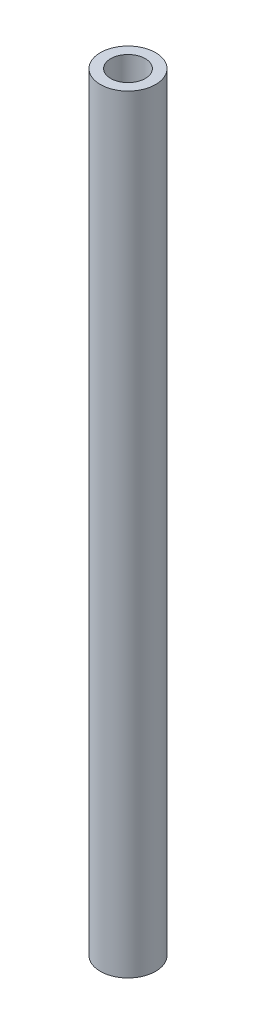
ISO-10303-21;
HEADER;
FILE_DESCRIPTION(('STEP AP214'),'2;1');
FILE_NAME('part.step','',(''),(''),'','','');
FILE_SCHEMA(('AUTOMOTIVE_DESIGN { 1 0 10303 214 1 1 1 1 }'));
ENDSEC;
DATA;
#1=APPLICATION_CONTEXT('core data for automotive mechanical design processes');
#2=APPLICATION_PROTOCOL_DEFINITION('international standard','automotive_design',2000,#1);
#3=PRODUCT_CONTEXT('',#1,'mechanical');
#4=PRODUCT('Part','Part','',(#3));
#5=PRODUCT_RELATED_PRODUCT_CATEGORY('part','',(#4));
#6=PRODUCT_DEFINITION_FORMATION('','',#4);
#7=PRODUCT_DEFINITION_CONTEXT('part definition',#1,'design');
#8=PRODUCT_DEFINITION('design','',#6,#7);
#9=PRODUCT_DEFINITION_SHAPE('','',#8);
#10=(LENGTH_UNIT() NAMED_UNIT(*) SI_UNIT(.MILLI.,.METRE.));
#11=(NAMED_UNIT(*) PLANE_ANGLE_UNIT() SI_UNIT($,.RADIAN.));
#12=(NAMED_UNIT(*) SI_UNIT($,.STERADIAN.) SOLID_ANGLE_UNIT());
#13=UNCERTAINTY_MEASURE_WITH_UNIT(LENGTH_MEASURE(1.E-05),#10,'distance_accuracy_value','');
#14=(GEOMETRIC_REPRESENTATION_CONTEXT(3) GLOBAL_UNCERTAINTY_ASSIGNED_CONTEXT((#13)) GLOBAL_UNIT_ASSIGNED_CONTEXT((#10,
#11,#12)) REPRESENTATION_CONTEXT('',''));
#15=CARTESIAN_POINT('',(0.,0.,0.));
#16=DIRECTION('',(0.,0.,1.));
#17=DIRECTION('',(1.,0.,0.));
#18=AXIS2_PLACEMENT_3D('',#15,#16,#17);
#19=CARTESIAN_POINT('',(0.,27.8,0.));
#20=DIRECTION('',(0.,-1.,0.));
#21=DIRECTION('',(0.,0.,-1.));
#22=AXIS2_PLACEMENT_3D('',#19,#20,#21);
#23=CYLINDRICAL_SURFACE('',#22,1.);
#24=CARTESIAN_POINT('',(0.,27.8,0.));
#25=DIRECTION('',(0.,1.,0.));
#26=DIRECTION('',(0.,0.,1.));
#27=AXIS2_PLACEMENT_3D('',#24,#25,#26);
#28=CIRCLE('',#27,1.);
#29=CARTESIAN_POINT('',(0.,27.8,1.));
#30=VERTEX_POINT('',#29);
#31=EDGE_CURVE('E11',#30,#30,#28,.T.);
#32=ORIENTED_EDGE('',*,*,#31,.F.);
#33=EDGE_LOOP('',(#32));
#34=FACE_BOUND('',#33,.T.);
#35=CARTESIAN_POINT('',(0.,0.,0.));
#36=DIRECTION('',(0.,1.,0.));
#37=DIRECTION('',(0.,0.,1.));
#38=AXIS2_PLACEMENT_3D('',#35,#36,#37);
#39=CIRCLE('',#38,1.);
#40=CARTESIAN_POINT('',(0.,0.,1.));
#41=VERTEX_POINT('',#40);
#42=EDGE_CURVE('E46',#41,#41,#39,.T.);
#43=ORIENTED_EDGE('',*,*,#42,.T.);
#44=EDGE_LOOP('',(#43));
#45=FACE_BOUND('',#44,.T.);
#46=ADVANCED_FACE('F43',(#34,#45),#23,.T.);
#47=CARTESIAN_POINT('',(0.,27.8,0.));
#48=DIRECTION('',(0.,1.,0.));
#49=DIRECTION('',(0.,0.,1.));
#50=AXIS2_PLACEMENT_3D('',#47,#48,#49);
#51=PLANE('',#50);
#52=CARTESIAN_POINT('',(0.,27.8,0.));
#53=DIRECTION('',(0.,1.,0.));
#54=DIRECTION('',(0.,0.,1.));
#55=AXIS2_PLACEMENT_3D('',#52,#53,#54);
#56=CIRCLE('',#55,0.624999999999999);
#57=CARTESIAN_POINT('',(0.,27.8,0.624999999999999));
#58=VERTEX_POINT('',#57);
#59=EDGE_CURVE('E66',#58,#58,#56,.T.);
#60=ORIENTED_EDGE('',*,*,#59,.F.);
#61=EDGE_LOOP('',(#60));
#62=FACE_BOUND('',#61,.T.);
#63=ORIENTED_EDGE('',*,*,#31,.T.);
#64=EDGE_LOOP('',(#63));
#65=FACE_BOUND('',#64,.T.);
#66=ADVANCED_FACE('F85',(#62,#65),#51,.T.);
#67=CARTESIAN_POINT('',(0.,0.,0.));
#68=DIRECTION('',(0.,1.,0.));
#69=DIRECTION('',(0.,0.,1.));
#70=AXIS2_PLACEMENT_3D('',#67,#68,#69);
#71=PLANE('',#70);
#72=CARTESIAN_POINT('',(0.,0.,0.));
#73=DIRECTION('',(0.,-1.,0.));
#74=DIRECTION('',(0.,0.,-1.));
#75=AXIS2_PLACEMENT_3D('',#72,#73,#74);
#76=CIRCLE('',#75,0.624999999999999);
#77=CARTESIAN_POINT('',(0.,0.,-0.624999999999999));
#78=VERTEX_POINT('',#77);
#79=EDGE_CURVE('E67',#78,#78,#76,.T.);
#80=ORIENTED_EDGE('',*,*,#79,.F.);
#81=EDGE_LOOP('',(#80));
#82=FACE_BOUND('',#81,.T.);
#83=ORIENTED_EDGE('',*,*,#42,.F.);
#84=EDGE_LOOP('',(#83));
#85=FACE_BOUND('',#84,.T.);
#86=ADVANCED_FACE('F82',(#82,#85),#71,.F.);
#87=CARTESIAN_POINT('',(0.,21.8,0.));
#88=DIRECTION('',(0.,1.,0.));
#89=DIRECTION('',(0.,0.,1.));
#90=AXIS2_PLACEMENT_3D('',#87,#88,#89);
#91=CONICAL_SURFACE('',#90,0.624999999999999,1.02974425867665);
#92=CARTESIAN_POINT('',(0.,21.4244621131078,0.));
#93=VERTEX_POINT('',#92);
#94=VERTEX_LOOP('',#93);
#95=FACE_BOUND('',#94,.T.);
#96=CARTESIAN_POINT('',(0.,21.8,0.));
#97=DIRECTION('',(0.,1.,0.));
#98=DIRECTION('',(0.,0.,1.));
#99=AXIS2_PLACEMENT_3D('',#96,#97,#98);
#100=CIRCLE('',#99,0.624999999999999);
#101=CARTESIAN_POINT('',(0.,21.8,0.624999999999999));
#102=VERTEX_POINT('',#101);
#103=EDGE_CURVE('E70',#102,#102,#100,.T.);
#104=ORIENTED_EDGE('',*,*,#103,.T.);
#105=EDGE_LOOP('',(#104));
#106=FACE_BOUND('',#105,.T.);
#107=ADVANCED_FACE('F84',(#95,#106),#91,.F.);
#108=CARTESIAN_POINT('',(0.,27.8,0.));
#109=DIRECTION('',(0.,1.,0.));
#110=DIRECTION('',(0.,0.,1.));
#111=AXIS2_PLACEMENT_3D('',#108,#109,#110);
#112=CYLINDRICAL_SURFACE('',#111,0.624999999999999);
#113=ORIENTED_EDGE('',*,*,#103,.F.);
#114=EDGE_LOOP('',(#113));
#115=FACE_BOUND('',#114,.T.);
#116=ORIENTED_EDGE('',*,*,#59,.T.);
#117=EDGE_LOOP('',(#116));
#118=FACE_BOUND('',#117,.T.);
#119=ADVANCED_FACE('F60',(#115,#118),#112,.F.);
#120=CARTESIAN_POINT('',(0.,6.,0.));
#121=DIRECTION('',(0.,-1.,0.));
#122=DIRECTION('',(0.,0.,-1.));
#123=AXIS2_PLACEMENT_3D('',#120,#121,#122);
#124=CONICAL_SURFACE('',#123,0.624999999999999,1.02974425867665);
#125=CARTESIAN_POINT('',(0.,6.37553788689223,0.));
#126=VERTEX_POINT('',#125);
#127=VERTEX_LOOP('',#126);
#128=FACE_BOUND('',#127,.T.);
#129=CARTESIAN_POINT('',(0.,6.,0.));
#130=DIRECTION('',(0.,-1.,0.));
#131=DIRECTION('',(0.,0.,-1.));
#132=AXIS2_PLACEMENT_3D('',#129,#130,#131);
#133=CIRCLE('',#132,0.624999999999999);
#134=CARTESIAN_POINT('',(0.,6.,-0.624999999999999));
#135=VERTEX_POINT('',#134);
#136=EDGE_CURVE('E64',#135,#135,#133,.T.);
#137=ORIENTED_EDGE('',*,*,#136,.T.);
#138=EDGE_LOOP('',(#137));
#139=FACE_BOUND('',#138,.T.);
#140=ADVANCED_FACE('F56',(#128,#139),#124,.F.);
#141=CARTESIAN_POINT('',(0.,0.,0.));
#142=DIRECTION('',(0.,-1.,0.));
#143=DIRECTION('',(0.,0.,-1.));
#144=AXIS2_PLACEMENT_3D('',#141,#142,#143);
#145=CYLINDRICAL_SURFACE('',#144,0.624999999999999);
#146=ORIENTED_EDGE('',*,*,#136,.F.);
#147=EDGE_LOOP('',(#146));
#148=FACE_BOUND('',#147,.T.);
#149=ORIENTED_EDGE('',*,*,#79,.T.);
#150=EDGE_LOOP('',(#149));
#151=FACE_BOUND('',#150,.T.);
#152=ADVANCED_FACE('F59',(#148,#151),#145,.F.);
#153=CLOSED_SHELL('',(#46,#66,#86,#107,#119,#140,#152));
#154=MANIFOLD_SOLID_BREP('B2',#153);
#155=ADVANCED_BREP_SHAPE_REPRESENTATION('',(#18,#154),#14);
#156=SHAPE_DEFINITION_REPRESENTATION(#9,#155);
ENDSEC;
END-ISO-10303-21;
